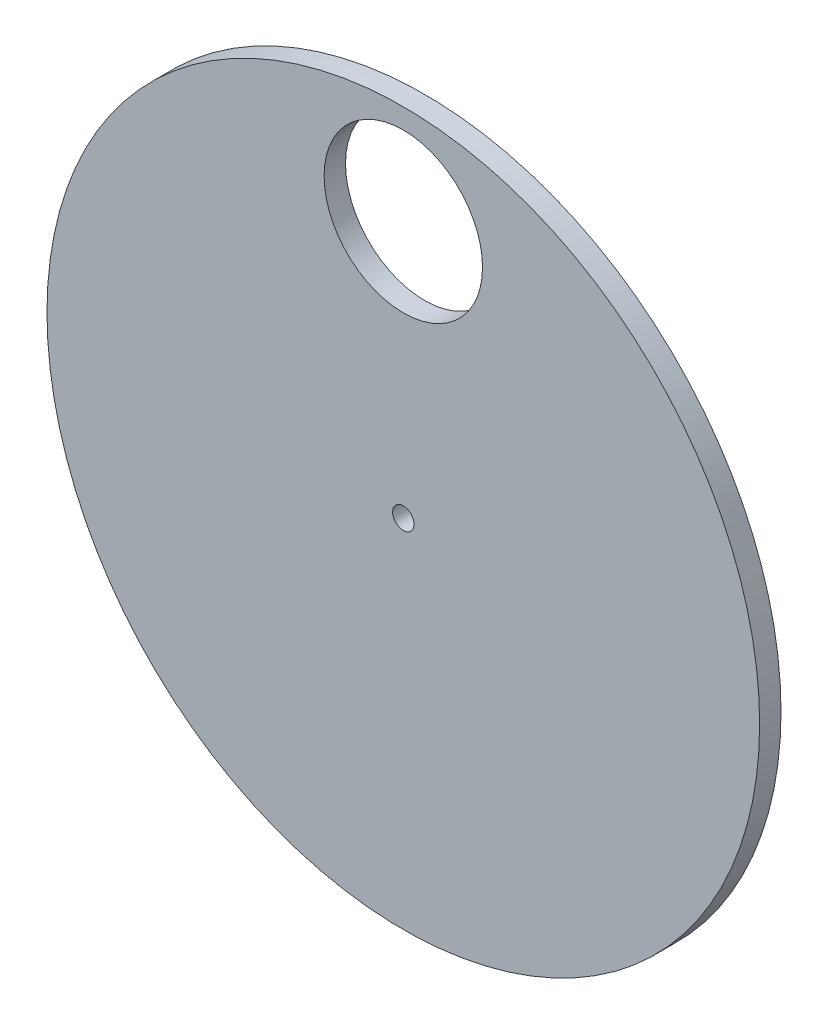
ISO-10303-21;
HEADER;
FILE_DESCRIPTION(('STEP AP214'),'2;1');
FILE_NAME('part.step','',(''),(''),'','','');
FILE_SCHEMA(('AUTOMOTIVE_DESIGN { 1 0 10303 214 1 1 1 1 }'));
ENDSEC;
DATA;
#1=APPLICATION_CONTEXT('core data for automotive mechanical design processes');
#2=APPLICATION_PROTOCOL_DEFINITION('international standard','automotive_design',2000,#1);
#3=PRODUCT_CONTEXT('',#1,'mechanical');
#4=PRODUCT('Part','Part','',(#3));
#5=PRODUCT_RELATED_PRODUCT_CATEGORY('part','',(#4));
#6=PRODUCT_DEFINITION_FORMATION('','',#4);
#7=PRODUCT_DEFINITION_CONTEXT('part definition',#1,'design');
#8=PRODUCT_DEFINITION('design','',#6,#7);
#9=PRODUCT_DEFINITION_SHAPE('','',#8);
#10=(LENGTH_UNIT() NAMED_UNIT(*) SI_UNIT(.MILLI.,.METRE.));
#11=(NAMED_UNIT(*) PLANE_ANGLE_UNIT() SI_UNIT($,.RADIAN.));
#12=(NAMED_UNIT(*) SI_UNIT($,.STERADIAN.) SOLID_ANGLE_UNIT());
#13=UNCERTAINTY_MEASURE_WITH_UNIT(LENGTH_MEASURE(1.E-05),#10,'distance_accuracy_value','');
#14=(GEOMETRIC_REPRESENTATION_CONTEXT(3) GLOBAL_UNCERTAINTY_ASSIGNED_CONTEXT((#13)) GLOBAL_UNIT_ASSIGNED_CONTEXT((#10,
#11,#12)) REPRESENTATION_CONTEXT('',''));
#15=CARTESIAN_POINT('',(0.,0.,0.));
#16=DIRECTION('',(0.,0.,1.));
#17=DIRECTION('',(1.,0.,0.));
#18=AXIS2_PLACEMENT_3D('',#15,#16,#17);
#19=CARTESIAN_POINT('',(0.,0.,6.));
#20=DIRECTION('',(0.,0.,-1.));
#21=DIRECTION('',(-1.,0.,0.));
#22=AXIS2_PLACEMENT_3D('',#19,#20,#21);
#23=CYLINDRICAL_SURFACE('',#22,100.);
#24=CARTESIAN_POINT('',(0.,0.,6.));
#25=DIRECTION('',(0.,0.,1.));
#26=DIRECTION('',(1.,0.,0.));
#27=AXIS2_PLACEMENT_3D('',#24,#25,#26);
#28=CIRCLE('',#27,100.);
#29=CARTESIAN_POINT('',(100.,0.,6.));
#30=VERTEX_POINT('',#29);
#31=EDGE_CURVE('E10',#30,#30,#28,.T.);
#32=ORIENTED_EDGE('',*,*,#31,.F.);
#33=EDGE_LOOP('',(#32));
#34=FACE_BOUND('',#33,.T.);
#35=CARTESIAN_POINT('',(0.,0.,0.));
#36=DIRECTION('',(0.,0.,1.));
#37=DIRECTION('',(1.,0.,0.));
#38=AXIS2_PLACEMENT_3D('',#35,#36,#37);
#39=CIRCLE('',#38,100.);
#40=CARTESIAN_POINT('',(100.,0.,0.));
#41=VERTEX_POINT('',#40);
#42=EDGE_CURVE('E39',#41,#41,#39,.T.);
#43=ORIENTED_EDGE('',*,*,#42,.T.);
#44=EDGE_LOOP('',(#43));
#45=FACE_BOUND('',#44,.T.);
#46=ADVANCED_FACE('F36',(#34,#45),#23,.T.);
#47=CARTESIAN_POINT('',(0.,0.,6.));
#48=DIRECTION('',(0.,0.,1.));
#49=DIRECTION('',(1.,0.,0.));
#50=AXIS2_PLACEMENT_3D('',#47,#48,#49);
#51=PLANE('',#50);
#52=CARTESIAN_POINT('',(0.,72.1105213259521,6.));
#53=DIRECTION('',(0.,0.,1.));
#54=DIRECTION('',(1.,0.,0.));
#55=AXIS2_PLACEMENT_3D('',#52,#53,#54);
#56=CIRCLE('',#55,22.225);
#57=CARTESIAN_POINT('',(22.225,72.1105213259521,6.));
#58=VERTEX_POINT('',#57);
#59=EDGE_CURVE('E54',#58,#58,#56,.T.);
#60=ORIENTED_EDGE('',*,*,#59,.F.);
#61=EDGE_LOOP('',(#60));
#62=FACE_BOUND('',#61,.T.);
#63=CARTESIAN_POINT('',(0.,0.,6.));
#64=DIRECTION('',(0.,0.,1.));
#65=DIRECTION('',(1.,0.,0.));
#66=AXIS2_PLACEMENT_3D('',#63,#64,#65);
#67=CIRCLE('',#66,3.);
#68=CARTESIAN_POINT('',(3.,0.,6.));
#69=VERTEX_POINT('',#68);
#70=EDGE_CURVE('E50',#69,#69,#67,.T.);
#71=ORIENTED_EDGE('',*,*,#70,.F.);
#72=EDGE_LOOP('',(#71));
#73=FACE_BOUND('',#72,.T.);
#74=ORIENTED_EDGE('',*,*,#31,.T.);
#75=EDGE_LOOP('',(#74));
#76=FACE_BOUND('',#75,.T.);
#77=ADVANCED_FACE('F72',(#62,#73,#76),#51,.T.);
#78=CARTESIAN_POINT('',(0.,0.,0.));
#79=DIRECTION('',(0.,0.,1.));
#80=DIRECTION('',(1.,0.,0.));
#81=AXIS2_PLACEMENT_3D('',#78,#79,#80);
#82=PLANE('',#81);
#83=CARTESIAN_POINT('',(0.,72.1105213259521,0.));
#84=DIRECTION('',(0.,0.,-1.));
#85=DIRECTION('',(-1.,0.,0.));
#86=AXIS2_PLACEMENT_3D('',#83,#84,#85);
#87=CIRCLE('',#86,22.225);
#88=CARTESIAN_POINT('',(-22.225,72.1105213259521,0.));
#89=VERTEX_POINT('',#88);
#90=EDGE_CURVE('E61',#89,#89,#87,.T.);
#91=ORIENTED_EDGE('',*,*,#90,.F.);
#92=EDGE_LOOP('',(#91));
#93=FACE_BOUND('',#92,.T.);
#94=CARTESIAN_POINT('',(0.,0.,0.));
#95=DIRECTION('',(0.,0.,1.));
#96=DIRECTION('',(1.,0.,0.));
#97=AXIS2_PLACEMENT_3D('',#94,#95,#96);
#98=CIRCLE('',#97,3.);
#99=CARTESIAN_POINT('',(3.,0.,0.));
#100=VERTEX_POINT('',#99);
#101=EDGE_CURVE('E48',#100,#100,#98,.T.);
#102=ORIENTED_EDGE('',*,*,#101,.T.);
#103=EDGE_LOOP('',(#102));
#104=FACE_BOUND('',#103,.T.);
#105=ORIENTED_EDGE('',*,*,#42,.F.);
#106=EDGE_LOOP('',(#105));
#107=FACE_BOUND('',#106,.T.);
#108=ADVANCED_FACE('F68',(#93,#104,#107),#82,.F.);
#109=CARTESIAN_POINT('',(0.,0.,0.));
#110=DIRECTION('',(0.,0.,1.));
#111=DIRECTION('',(1.,0.,0.));
#112=AXIS2_PLACEMENT_3D('',#109,#110,#111);
#113=CYLINDRICAL_SURFACE('',#112,3.);
#114=ORIENTED_EDGE('',*,*,#101,.F.);
#115=EDGE_LOOP('',(#114));
#116=FACE_BOUND('',#115,.T.);
#117=ORIENTED_EDGE('',*,*,#70,.T.);
#118=EDGE_LOOP('',(#117));
#119=FACE_BOUND('',#118,.T.);
#120=ADVANCED_FACE('F71',(#116,#119),#113,.F.);
#121=CARTESIAN_POINT('',(0.,72.1105213259521,10.));
#122=DIRECTION('',(0.,0.,-1.));
#123=DIRECTION('',(-1.,0.,0.));
#124=AXIS2_PLACEMENT_3D('',#121,#122,#123);
#125=CYLINDRICAL_SURFACE('',#124,22.225);
#126=ORIENTED_EDGE('',*,*,#59,.T.);
#127=EDGE_LOOP('',(#126));
#128=FACE_BOUND('',#127,.T.);
#129=ORIENTED_EDGE('',*,*,#90,.T.);
#130=EDGE_LOOP('',(#129));
#131=FACE_BOUND('',#130,.T.);
#132=ADVANCED_FACE('F66',(#128,#131),#125,.F.);
#133=CLOSED_SHELL('',(#46,#77,#108,#120,#132));
#134=MANIFOLD_SOLID_BREP('B2',#133);
#135=ADVANCED_BREP_SHAPE_REPRESENTATION('',(#18,#134),#14);
#136=SHAPE_DEFINITION_REPRESENTATION(#9,#135);
ENDSEC;
END-ISO-10303-21;
